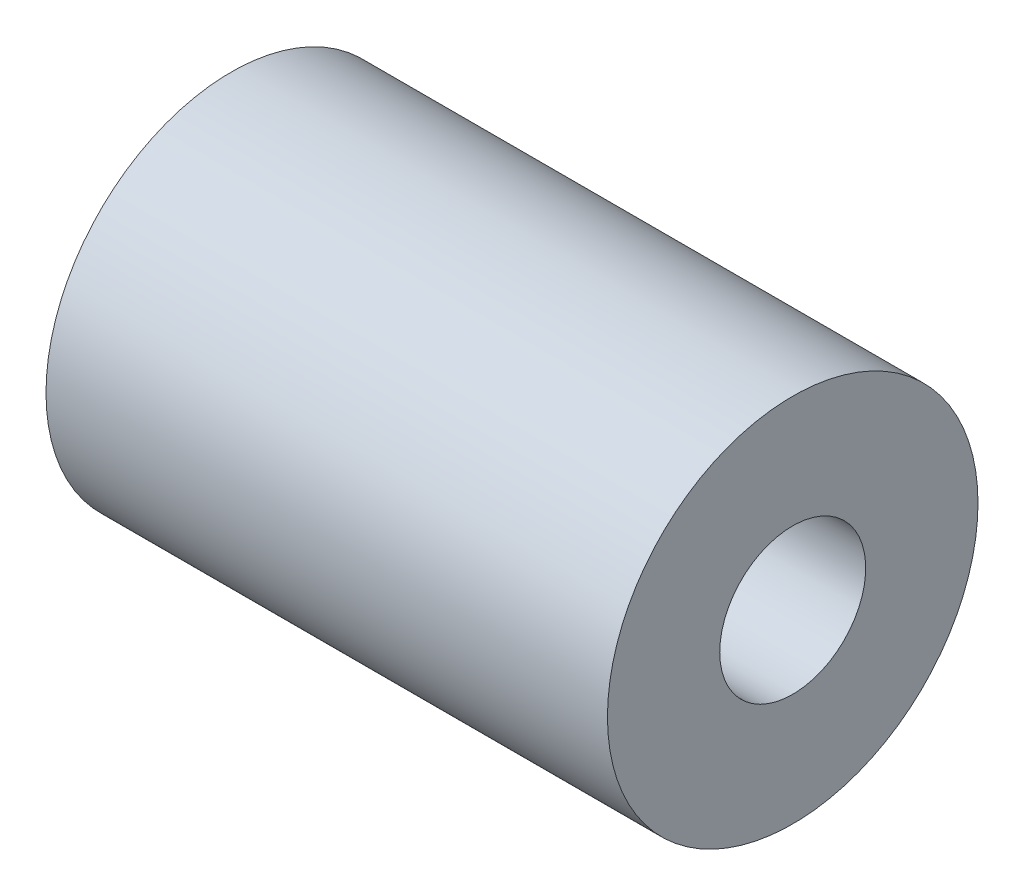
ISO-10303-21;
HEADER;
FILE_DESCRIPTION(('STEP AP214'),'2;1');
FILE_NAME('part.step','',(''),(''),'','','');
FILE_SCHEMA(('AUTOMOTIVE_DESIGN { 1 0 10303 214 1 1 1 1 }'));
ENDSEC;
DATA;
#1=APPLICATION_CONTEXT('core data for automotive mechanical design processes');
#2=APPLICATION_PROTOCOL_DEFINITION('international standard','automotive_design',2000,#1);
#3=PRODUCT_CONTEXT('',#1,'mechanical');
#4=PRODUCT('Part','Part','',(#3));
#5=PRODUCT_RELATED_PRODUCT_CATEGORY('part','',(#4));
#6=PRODUCT_DEFINITION_FORMATION('','',#4);
#7=PRODUCT_DEFINITION_CONTEXT('part definition',#1,'design');
#8=PRODUCT_DEFINITION('design','',#6,#7);
#9=PRODUCT_DEFINITION_SHAPE('','',#8);
#10=(LENGTH_UNIT() NAMED_UNIT(*) SI_UNIT(.MILLI.,.METRE.));
#11=(NAMED_UNIT(*) PLANE_ANGLE_UNIT() SI_UNIT($,.RADIAN.));
#12=(NAMED_UNIT(*) SI_UNIT($,.STERADIAN.) SOLID_ANGLE_UNIT());
#13=UNCERTAINTY_MEASURE_WITH_UNIT(LENGTH_MEASURE(1.E-05),#10,'distance_accuracy_value','');
#14=(GEOMETRIC_REPRESENTATION_CONTEXT(3) GLOBAL_UNCERTAINTY_ASSIGNED_CONTEXT((#13)) GLOBAL_UNIT_ASSIGNED_CONTEXT((#10,
#11,#12)) REPRESENTATION_CONTEXT('',''));
#15=CARTESIAN_POINT('',(0.,0.,0.));
#16=DIRECTION('',(0.,0.,1.));
#17=DIRECTION('',(1.,0.,0.));
#18=AXIS2_PLACEMENT_3D('',#15,#16,#17);
#19=CARTESIAN_POINT('',(0.,0.,0.));
#20=DIRECTION('',(-1.,0.,0.));
#21=DIRECTION('',(0.,0.,1.));
#22=AXIS2_PLACEMENT_3D('',#19,#20,#21);
#23=CYLINDRICAL_SURFACE('',#22,3.302);
#24=CARTESIAN_POINT('',(25.4,0.,0.));
#25=DIRECTION('',(-1.,0.,0.));
#26=DIRECTION('',(0.,0.,1.));
#27=AXIS2_PLACEMENT_3D('',#24,#25,#26);
#28=CIRCLE('',#27,3.302);
#29=CARTESIAN_POINT('',(25.4,0.,3.302));
#30=VERTEX_POINT('',#29);
#31=EDGE_CURVE('E17',#30,#30,#28,.T.);
#32=ORIENTED_EDGE('',*,*,#31,.F.);
#33=EDGE_LOOP('',(#32));
#34=FACE_BOUND('',#33,.T.);
#35=CARTESIAN_POINT('',(0.,0.,0.));
#36=DIRECTION('',(-1.,0.,0.));
#37=DIRECTION('',(0.,0.,1.));
#38=AXIS2_PLACEMENT_3D('',#35,#36,#37);
#39=CIRCLE('',#38,3.302);
#40=CARTESIAN_POINT('',(0.,0.,3.302));
#41=VERTEX_POINT('',#40);
#42=EDGE_CURVE('E26',#41,#41,#39,.T.);
#43=ORIENTED_EDGE('',*,*,#42,.T.);
#44=EDGE_LOOP('',(#43));
#45=FACE_BOUND('',#44,.T.);
#46=ADVANCED_FACE('F14',(#34,#45),#23,.F.);
#47=CARTESIAN_POINT('',(25.4,0.,0.));
#48=DIRECTION('',(1.,0.,0.));
#49=DIRECTION('',(0.,0.,-1.));
#50=AXIS2_PLACEMENT_3D('',#47,#48,#49);
#51=PLANE('',#50);
#52=ORIENTED_EDGE('',*,*,#31,.T.);
#53=EDGE_LOOP('',(#52));
#54=FACE_BOUND('',#53,.T.);
#55=CARTESIAN_POINT('',(25.4,0.,0.));
#56=DIRECTION('',(1.,0.,0.));
#57=DIRECTION('',(0.,0.,-1.));
#58=AXIS2_PLACEMENT_3D('',#55,#56,#57);
#59=CIRCLE('',#58,8.382);
#60=CARTESIAN_POINT('',(25.4,0.,-8.382));
#61=VERTEX_POINT('',#60);
#62=EDGE_CURVE('E21',#61,#61,#59,.F.);
#63=ORIENTED_EDGE('',*,*,#62,.F.);
#64=EDGE_LOOP('',(#63));
#65=FACE_BOUND('',#64,.T.);
#66=ADVANCED_FACE('F34',(#54,#65),#51,.T.);
#67=CARTESIAN_POINT('',(0.,0.,0.));
#68=DIRECTION('',(1.,0.,0.));
#69=DIRECTION('',(0.,0.,-1.));
#70=AXIS2_PLACEMENT_3D('',#67,#68,#69);
#71=PLANE('',#70);
#72=ORIENTED_EDGE('',*,*,#42,.F.);
#73=EDGE_LOOP('',(#72));
#74=FACE_BOUND('',#73,.T.);
#75=CARTESIAN_POINT('',(0.,0.,0.));
#76=DIRECTION('',(1.,0.,0.));
#77=DIRECTION('',(0.,0.,-1.));
#78=AXIS2_PLACEMENT_3D('',#75,#76,#77);
#79=CIRCLE('',#78,8.382);
#80=CARTESIAN_POINT('',(0.,0.,-8.382));
#81=VERTEX_POINT('',#80);
#82=EDGE_CURVE('E10',#81,#81,#79,.T.);
#83=ORIENTED_EDGE('',*,*,#82,.F.);
#84=EDGE_LOOP('',(#83));
#85=FACE_BOUND('',#84,.T.);
#86=ADVANCED_FACE('F42',(#74,#85),#71,.F.);
#87=CARTESIAN_POINT('',(0.,0.,0.));
#88=DIRECTION('',(1.,0.,0.));
#89=DIRECTION('',(0.,0.,-1.));
#90=AXIS2_PLACEMENT_3D('',#87,#88,#89);
#91=CYLINDRICAL_SURFACE('',#90,8.382);
#92=ORIENTED_EDGE('',*,*,#62,.T.);
#93=EDGE_LOOP('',(#92));
#94=FACE_BOUND('',#93,.T.);
#95=ORIENTED_EDGE('',*,*,#82,.T.);
#96=EDGE_LOOP('',(#95));
#97=FACE_BOUND('',#96,.T.);
#98=ADVANCED_FACE('F43',(#94,#97),#91,.T.);
#99=CLOSED_SHELL('',(#46,#66,#86,#98));
#100=MANIFOLD_SOLID_BREP('B1',#99);
#101=ADVANCED_BREP_SHAPE_REPRESENTATION('',(#18,#100),#14);
#102=SHAPE_DEFINITION_REPRESENTATION(#9,#101);
ENDSEC;
END-ISO-10303-21;
